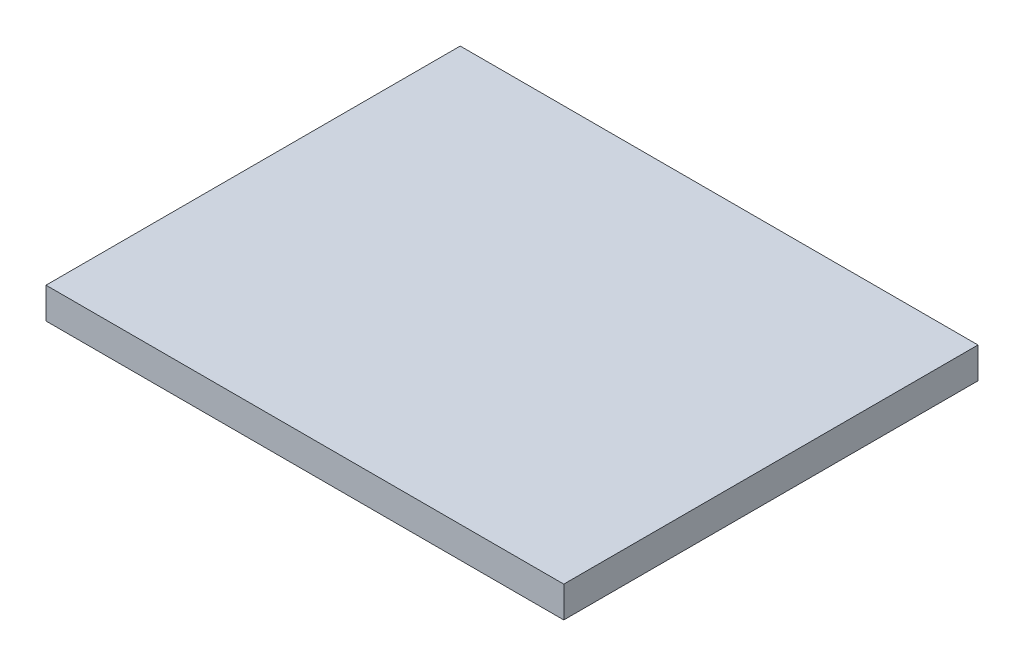
ISO-10303-21;
HEADER;
FILE_DESCRIPTION(('STEP AP214'),'2;1');
FILE_NAME('part.step','',(''),(''),'','','');
FILE_SCHEMA(('AUTOMOTIVE_DESIGN { 1 0 10303 214 1 1 1 1 }'));
ENDSEC;
DATA;
#1=APPLICATION_CONTEXT('core data for automotive mechanical design processes');
#2=APPLICATION_PROTOCOL_DEFINITION('international standard','automotive_design',2000,#1);
#3=PRODUCT_CONTEXT('',#1,'mechanical');
#4=PRODUCT('Part','Part','',(#3));
#5=PRODUCT_RELATED_PRODUCT_CATEGORY('part','',(#4));
#6=PRODUCT_DEFINITION_FORMATION('','',#4);
#7=PRODUCT_DEFINITION_CONTEXT('part definition',#1,'design');
#8=PRODUCT_DEFINITION('design','',#6,#7);
#9=PRODUCT_DEFINITION_SHAPE('','',#8);
#10=(LENGTH_UNIT() NAMED_UNIT(*) SI_UNIT(.MILLI.,.METRE.));
#11=(NAMED_UNIT(*) PLANE_ANGLE_UNIT() SI_UNIT($,.RADIAN.));
#12=(NAMED_UNIT(*) SI_UNIT($,.STERADIAN.) SOLID_ANGLE_UNIT());
#13=UNCERTAINTY_MEASURE_WITH_UNIT(LENGTH_MEASURE(1.E-05),#10,'distance_accuracy_value','');
#14=(GEOMETRIC_REPRESENTATION_CONTEXT(3) GLOBAL_UNCERTAINTY_ASSIGNED_CONTEXT((#13)) GLOBAL_UNIT_ASSIGNED_CONTEXT((#10,
#11,#12)) REPRESENTATION_CONTEXT('',''));
#15=CARTESIAN_POINT('',(0.,0.,0.));
#16=DIRECTION('',(0.,0.,1.));
#17=DIRECTION('',(1.,0.,0.));
#18=AXIS2_PLACEMENT_3D('',#15,#16,#17);
#19=CARTESIAN_POINT('',(25.,3.,-20.));
#20=DIRECTION('',(-1.,0.,0.));
#21=DIRECTION('',(0.,0.,1.));
#22=AXIS2_PLACEMENT_3D('',#19,#20,#21);
#23=PLANE('',#22);
#24=DIRECTION('',(0.,0.,-1.));
#25=VECTOR('',#24,1.);
#26=CARTESIAN_POINT('',(25.,0.,-20.));
#27=LINE('',#26,#25);
#28=CARTESIAN_POINT('',(25.,0.,20.));
#29=VERTEX_POINT('',#28);
#30=CARTESIAN_POINT('',(25.,0.,-20.));
#31=VERTEX_POINT('',#30);
#32=EDGE_CURVE('E111',#29,#31,#27,.T.);
#33=ORIENTED_EDGE('',*,*,#32,.T.);
#34=DIRECTION('',(0.,-1.,0.));
#35=VECTOR('',#34,1.);
#36=CARTESIAN_POINT('',(25.,3.,-20.));
#37=LINE('',#36,#35);
#38=CARTESIAN_POINT('',(25.,3.,-20.));
#39=VERTEX_POINT('',#38);
#40=EDGE_CURVE('E11',#39,#31,#37,.T.);
#41=ORIENTED_EDGE('',*,*,#40,.F.);
#42=DIRECTION('',(0.,0.,-1.));
#43=VECTOR('',#42,1.);
#44=CARTESIAN_POINT('',(25.,3.,-20.));
#45=LINE('',#44,#43);
#46=CARTESIAN_POINT('',(25.,3.,20.));
#47=VERTEX_POINT('',#46);
#48=EDGE_CURVE('E95',#47,#39,#45,.T.);
#49=ORIENTED_EDGE('',*,*,#48,.F.);
#50=DIRECTION('',(0.,-1.,0.));
#51=VECTOR('',#50,1.);
#52=CARTESIAN_POINT('',(25.,3.,20.));
#53=LINE('',#52,#51);
#54=EDGE_CURVE('E107',#47,#29,#53,.T.);
#55=ORIENTED_EDGE('',*,*,#54,.T.);
#56=EDGE_LOOP('',(#33,#41,#49,#55));
#57=FACE_BOUND('',#56,.T.);
#58=ADVANCED_FACE('F43',(#57),#23,.F.);
#59=CARTESIAN_POINT('',(-25.,3.,-20.));
#60=DIRECTION('',(0.,0.,1.));
#61=DIRECTION('',(1.,0.,0.));
#62=AXIS2_PLACEMENT_3D('',#59,#60,#61);
#63=PLANE('',#62);
#64=DIRECTION('',(-1.,0.,0.));
#65=VECTOR('',#64,1.);
#66=CARTESIAN_POINT('',(-25.,0.,-20.));
#67=LINE('',#66,#65);
#68=CARTESIAN_POINT('',(-25.,0.,-20.));
#69=VERTEX_POINT('',#68);
#70=EDGE_CURVE('E100',#31,#69,#67,.T.);
#71=ORIENTED_EDGE('',*,*,#70,.T.);
#72=DIRECTION('',(0.,-1.,0.));
#73=VECTOR('',#72,1.);
#74=CARTESIAN_POINT('',(-25.,3.,-20.));
#75=LINE('',#74,#73);
#76=CARTESIAN_POINT('',(-25.,3.,-20.));
#77=VERTEX_POINT('',#76);
#78=EDGE_CURVE('E52',#77,#69,#75,.T.);
#79=ORIENTED_EDGE('',*,*,#78,.F.);
#80=DIRECTION('',(-1.,0.,0.));
#81=VECTOR('',#80,1.);
#82=CARTESIAN_POINT('',(-25.,3.,-20.));
#83=LINE('',#82,#81);
#84=EDGE_CURVE('E90',#39,#77,#83,.T.);
#85=ORIENTED_EDGE('',*,*,#84,.F.);
#86=ORIENTED_EDGE('',*,*,#40,.T.);
#87=EDGE_LOOP('',(#71,#79,#85,#86));
#88=FACE_BOUND('',#87,.T.);
#89=ADVANCED_FACE('F99',(#88),#63,.F.);
#90=CARTESIAN_POINT('',(-25.,3.,-20.));
#91=DIRECTION('',(1.,0.,0.));
#92=DIRECTION('',(0.,0.,-1.));
#93=AXIS2_PLACEMENT_3D('',#90,#91,#92);
#94=PLANE('',#93);
#95=DIRECTION('',(0.,0.,1.));
#96=VECTOR('',#95,1.);
#97=CARTESIAN_POINT('',(-25.,0.,-20.));
#98=LINE('',#97,#96);
#99=CARTESIAN_POINT('',(-25.,0.,20.));
#100=VERTEX_POINT('',#99);
#101=EDGE_CURVE('E77',#69,#100,#98,.T.);
#102=ORIENTED_EDGE('',*,*,#101,.T.);
#103=DIRECTION('',(0.,-1.,0.));
#104=VECTOR('',#103,1.);
#105=CARTESIAN_POINT('',(-25.,3.,20.));
#106=LINE('',#105,#104);
#107=CARTESIAN_POINT('',(-25.,3.,20.));
#108=VERTEX_POINT('',#107);
#109=EDGE_CURVE('E102',#108,#100,#106,.T.);
#110=ORIENTED_EDGE('',*,*,#109,.F.);
#111=DIRECTION('',(0.,0.,1.));
#112=VECTOR('',#111,1.);
#113=CARTESIAN_POINT('',(-25.,3.,-20.));
#114=LINE('',#113,#112);
#115=EDGE_CURVE('E93',#77,#108,#114,.T.);
#116=ORIENTED_EDGE('',*,*,#115,.F.);
#117=ORIENTED_EDGE('',*,*,#78,.T.);
#118=EDGE_LOOP('',(#102,#110,#116,#117));
#119=FACE_BOUND('',#118,.T.);
#120=ADVANCED_FACE('F103',(#119),#94,.F.);
#121=CARTESIAN_POINT('',(-25.,3.,20.));
#122=DIRECTION('',(0.,0.,-1.));
#123=DIRECTION('',(-1.,0.,0.));
#124=AXIS2_PLACEMENT_3D('',#121,#122,#123);
#125=PLANE('',#124);
#126=DIRECTION('',(1.,0.,0.));
#127=VECTOR('',#126,1.);
#128=CARTESIAN_POINT('',(-25.,0.,20.));
#129=LINE('',#128,#127);
#130=EDGE_CURVE('E83',#100,#29,#129,.T.);
#131=ORIENTED_EDGE('',*,*,#130,.T.);
#132=ORIENTED_EDGE('',*,*,#54,.F.);
#133=DIRECTION('',(1.,0.,0.));
#134=VECTOR('',#133,1.);
#135=CARTESIAN_POINT('',(-25.,3.,20.));
#136=LINE('',#135,#134);
#137=EDGE_CURVE('E60',#108,#47,#136,.T.);
#138=ORIENTED_EDGE('',*,*,#137,.F.);
#139=ORIENTED_EDGE('',*,*,#109,.T.);
#140=EDGE_LOOP('',(#131,#132,#138,#139));
#141=FACE_BOUND('',#140,.T.);
#142=ADVANCED_FACE('F124',(#141),#125,.F.);
#143=CARTESIAN_POINT('',(0.,3.,0.));
#144=DIRECTION('',(0.,1.,0.));
#145=DIRECTION('',(0.,0.,1.));
#146=AXIS2_PLACEMENT_3D('',#143,#144,#145);
#147=PLANE('',#146);
#148=ORIENTED_EDGE('',*,*,#48,.T.);
#149=ORIENTED_EDGE('',*,*,#84,.T.);
#150=ORIENTED_EDGE('',*,*,#115,.T.);
#151=ORIENTED_EDGE('',*,*,#137,.T.);
#152=EDGE_LOOP('',(#148,#149,#150,#151));
#153=FACE_BOUND('',#152,.T.);
#154=ADVANCED_FACE('F91',(#153),#147,.T.);
#155=CARTESIAN_POINT('',(0.,0.,0.));
#156=DIRECTION('',(0.,1.,0.));
#157=DIRECTION('',(0.,0.,1.));
#158=AXIS2_PLACEMENT_3D('',#155,#156,#157);
#159=PLANE('',#158);
#160=ORIENTED_EDGE('',*,*,#32,.F.);
#161=ORIENTED_EDGE('',*,*,#130,.F.);
#162=ORIENTED_EDGE('',*,*,#101,.F.);
#163=ORIENTED_EDGE('',*,*,#70,.F.);
#164=EDGE_LOOP('',(#160,#161,#162,#163));
#165=FACE_BOUND('',#164,.T.);
#166=ADVANCED_FACE('F127',(#165),#159,.F.);
#167=CLOSED_SHELL('',(#58,#89,#120,#142,#154,#166));
#168=MANIFOLD_SOLID_BREP('B2',#167);
#169=ADVANCED_BREP_SHAPE_REPRESENTATION('',(#18,#168),#14);
#170=SHAPE_DEFINITION_REPRESENTATION(#9,#169);
ENDSEC;
END-ISO-10303-21;
